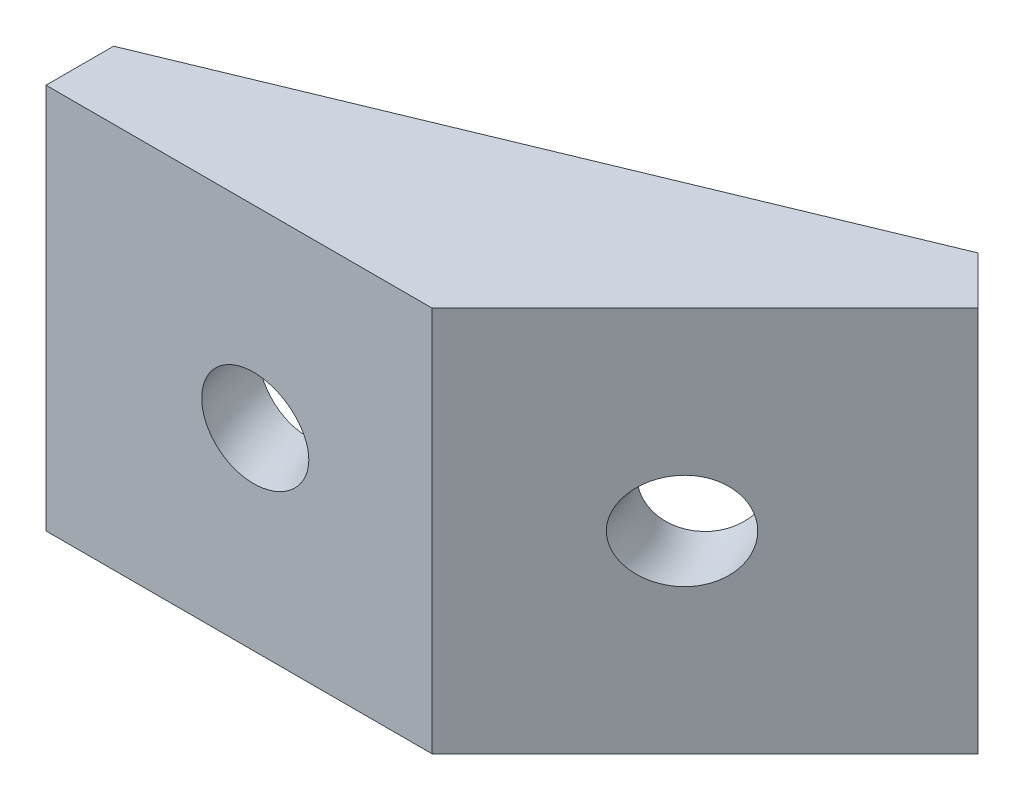
ISO-10303-21;
HEADER;
FILE_DESCRIPTION(('STEP AP214'),'2;1');
FILE_NAME('part.step','',(''),(''),'','','');
FILE_SCHEMA(('AUTOMOTIVE_DESIGN { 1 0 10303 214 1 1 1 1 }'));
ENDSEC;
DATA;
#1=APPLICATION_CONTEXT('core data for automotive mechanical design processes');
#2=APPLICATION_PROTOCOL_DEFINITION('international standard','automotive_design',2000,#1);
#3=PRODUCT_CONTEXT('',#1,'mechanical');
#4=PRODUCT('Part','Part','',(#3));
#5=PRODUCT_RELATED_PRODUCT_CATEGORY('part','',(#4));
#6=PRODUCT_DEFINITION_FORMATION('','',#4);
#7=PRODUCT_DEFINITION_CONTEXT('part definition',#1,'design');
#8=PRODUCT_DEFINITION('design','',#6,#7);
#9=PRODUCT_DEFINITION_SHAPE('','',#8);
#10=(LENGTH_UNIT() NAMED_UNIT(*) SI_UNIT(.MILLI.,.METRE.));
#11=(NAMED_UNIT(*) PLANE_ANGLE_UNIT() SI_UNIT($,.RADIAN.));
#12=(NAMED_UNIT(*) SI_UNIT($,.STERADIAN.) SOLID_ANGLE_UNIT());
#13=UNCERTAINTY_MEASURE_WITH_UNIT(LENGTH_MEASURE(1.E-05),#10,'distance_accuracy_value','');
#14=(GEOMETRIC_REPRESENTATION_CONTEXT(3) GLOBAL_UNCERTAINTY_ASSIGNED_CONTEXT((#13)) GLOBAL_UNIT_ASSIGNED_CONTEXT((#10,
#11,#12)) REPRESENTATION_CONTEXT('',''));
#15=CARTESIAN_POINT('',(0.,0.,0.));
#16=DIRECTION('',(0.,0.,1.));
#17=DIRECTION('',(1.,0.,0.));
#18=AXIS2_PLACEMENT_3D('',#15,#16,#17);
#19=CARTESIAN_POINT('',(14.142135623731,20.,-14.1421356237309));
#20=DIRECTION('',(-0.707106781186544,0.,-0.707106781186551));
#21=DIRECTION('',(-0.707106781186551,0.,0.707106781186544));
#22=AXIS2_PLACEMENT_3D('',#19,#20,#21);
#23=PLANE('',#22);
#24=DIRECTION('',(0.707106781186551,0.,-0.707106781186544));
#25=VECTOR('',#24,1.);
#26=CARTESIAN_POINT('',(14.142135623731,0.,-14.1421356237309));
#27=LINE('',#26,#25);
#28=CARTESIAN_POINT('',(0.,0.,0.));
#29=VERTEX_POINT('',#28);
#30=CARTESIAN_POINT('',(14.142135623731,0.,-14.1421356237309));
#31=VERTEX_POINT('',#30);
#32=EDGE_CURVE('E167',#29,#31,#27,.T.);
#33=ORIENTED_EDGE('',*,*,#32,.T.);
#34=DIRECTION('',(0.,-1.,0.));
#35=VECTOR('',#34,1.);
#36=CARTESIAN_POINT('',(14.142135623731,20.,-14.1421356237309));
#37=LINE('',#36,#35);
#38=CARTESIAN_POINT('',(14.142135623731,20.,-14.1421356237309));
#39=VERTEX_POINT('',#38);
#40=EDGE_CURVE('E11',#39,#31,#37,.T.);
#41=ORIENTED_EDGE('',*,*,#40,.F.);
#42=DIRECTION('',(0.707106781186551,0.,-0.707106781186544));
#43=VECTOR('',#42,1.);
#44=CARTESIAN_POINT('',(14.142135623731,20.,-14.1421356237309));
#45=LINE('',#44,#43);
#46=CARTESIAN_POINT('',(0.,20.,0.));
#47=VERTEX_POINT('',#46);
#48=EDGE_CURVE('E169',#47,#39,#45,.T.);
#49=ORIENTED_EDGE('',*,*,#48,.F.);
#50=DIRECTION('',(0.,-1.,0.));
#51=VECTOR('',#50,1.);
#52=CARTESIAN_POINT('',(0.,20.,0.));
#53=LINE('',#52,#51);
#54=EDGE_CURVE('E177',#47,#29,#53,.T.);
#55=ORIENTED_EDGE('',*,*,#54,.T.);
#56=EDGE_LOOP('',(#33,#41,#49,#55));
#57=FACE_BOUND('',#56,.T.);
#58=CARTESIAN_POINT('',(7.00793546357678,7.57457335447184,-7.00793546357671));
#59=CARTESIAN_POINT('',(7.11300703710958,7.6088847048434,-7.1130070371095));
#60=CARTESIAN_POINT('',(7.21615151872774,7.65511015868409,-7.21615151872766));
#61=CARTESIAN_POINT('',(7.4156584391318,7.77106559172266,-7.41565843913172));
#62=CARTESIAN_POINT('',(7.51202041490097,7.84079717371991,-7.51202041490089));
#63=CARTESIAN_POINT('',(7.69515062243347,8.00286288014445,-7.69515062243339));
#64=CARTESIAN_POINT('',(7.78189077116621,8.09526076382205,-7.78189077116612));
#65=CARTESIAN_POINT('',(7.94236496127605,8.30044230842607,-7.94236496127597));
#66=CARTESIAN_POINT('',(8.01610213426821,8.4132210475764,-8.01610213426813));
#67=CARTESIAN_POINT('',(8.14416068236348,8.64943054891973,-8.14416068236339));
#68=CARTESIAN_POINT('',(8.19931522123127,8.77195778065461,-8.19931522123118));
#69=CARTESIAN_POINT('',(8.29337171344352,9.02891183824999,-8.29337171344344));
#70=CARTESIAN_POINT('',(8.33227894894066,9.16333477945096,-8.33227894894057));
#71=CARTESIAN_POINT('',(8.39078019415316,9.4327681845553,-8.39078019415307));
#72=CARTESIAN_POINT('',(8.41126431331432,9.56739312063776,-8.41126431331423));
#73=CARTESIAN_POINT('',(8.43550447201303,9.8396155519687,-8.43550447201294));
#74=CARTESIAN_POINT('',(8.43926361998243,9.97721249007625,-8.43926361998234));
#75=CARTESIAN_POINT('',(8.43003882207714,10.2478070723917,-8.43003882207705));
#76=CARTESIAN_POINT('',(8.41747170485611,10.3808336179191,-8.41747170485603));
#77=CARTESIAN_POINT('',(8.37675702129216,10.6420172909983,-8.37675702129207));
#78=CARTESIAN_POINT('',(8.34860995367191,10.7701745742775,-8.34860995367183));
#79=CARTESIAN_POINT('',(8.27760834740178,11.0184305211267,-8.27760834740169));
#80=CARTESIAN_POINT('',(8.23471600646603,11.1385075138222,-8.23471600646595));
#81=CARTESIAN_POINT('',(8.13566116648802,11.3671439829561,-8.13566116648793));
#82=CARTESIAN_POINT('',(8.07949744282036,11.4757023951698,-8.07949744282027));
#83=CARTESIAN_POINT('',(7.95388770040742,11.6816436117172,-7.95388770040733));
#84=CARTESIAN_POINT('',(7.88410875889488,11.7786197409564,-7.8841087588948));
#85=CARTESIAN_POINT('',(7.73452147207409,11.9555863714837,-7.73452147207401));
#86=CARTESIAN_POINT('',(7.65471117922423,12.0355735663135,-7.65471117922415));
#87=CARTESIAN_POINT('',(7.48303410530092,12.180753951838,-7.48303410530084));
#88=CARTESIAN_POINT('',(7.39075949935397,12.2449814817206,-7.3907594993539));
#89=CARTESIAN_POINT('',(7.20024422390796,12.3521794419223,-7.20024422390789));
#90=CARTESIAN_POINT('',(7.10200189315453,12.3951439224513,-7.10200189315446));
#91=CARTESIAN_POINT('',(6.89526454568044,12.4617278024309,-6.89526454568037));
#92=CARTESIAN_POINT('',(6.78652633210816,12.4838353987163,-6.78652633210809));
#93=CARTESIAN_POINT('',(6.56795411381444,12.5037967863994,-6.56795411381437));
#94=CARTESIAN_POINT('',(6.45811979089834,12.5016433174724,-6.45811979089827));
#95=CARTESIAN_POINT('',(6.23205486196903,12.4728146623615,-6.23205486196896));
#96=CARTESIAN_POINT('',(6.11593609873216,12.4443774091688,-6.1159360987321));
#97=CARTESIAN_POINT('',(5.88833965445654,12.3616926563325,-5.88833965445648));
#98=CARTESIAN_POINT('',(5.77686476089468,12.307429890977,-5.77686476089462));
#99=CARTESIAN_POINT('',(5.55607277713517,12.171161011109,-5.55607277713512));
#100=CARTESIAN_POINT('',(5.44713827505273,12.0879100991108,-5.44713827505268));
#101=CARTESIAN_POINT('',(5.24102142879013,11.8961031066417,-5.24102142879008));
#102=CARTESIAN_POINT('',(5.14383208244554,11.7875622175701,-5.14383208244549));
#103=CARTESIAN_POINT('',(4.98135680974496,11.5688312586304,-4.9813568097449));
#104=CARTESIAN_POINT('',(4.91347918069405,11.4624804157877,-4.913479180694));
#105=CARTESIAN_POINT('',(4.79091977426208,11.2353184849157,-4.79091977426203));
#106=CARTESIAN_POINT('',(4.73623186168506,11.1145141591972,-4.73623186168502));
#107=CARTESIAN_POINT('',(4.66624608810088,10.9238481302738,-4.66624608810083));
#108=CARTESIAN_POINT('',(4.6448495329538,10.8583674680522,-4.64484953295375));
#109=CARTESIAN_POINT('',(4.60660110321435,10.7248176825582,-4.6066011032143));
#110=CARTESIAN_POINT('',(4.5897466812629,10.6567500346864,-4.58974668126286));
#111=CARTESIAN_POINT('',(4.56095380758557,10.5186201642891,-4.56095380758552));
#112=CARTESIAN_POINT('',(4.54901110509819,10.4485597227807,-4.54901110509815));
#113=CARTESIAN_POINT('',(4.53030333863013,10.3070970282286,-4.53030333863008));
#114=CARTESIAN_POINT('',(4.52353726114097,10.2356950406463,-4.52353726114092));
#115=CARTESIAN_POINT('',(4.51252649413541,10.0420486561876,-4.51252649413537));
#116=CARTESIAN_POINT('',(4.51334895761543,9.91914755388458,-4.51334895761538));
#117=CARTESIAN_POINT('',(4.53049202157717,9.67562112636098,-4.53049202157712));
#118=CARTESIAN_POINT('',(4.54681159340415,9.55499565063261,-4.5468115934041));
#119=CARTESIAN_POINT('',(4.59248410575177,9.32572415569555,-4.59248410575172));
#120=CARTESIAN_POINT('',(4.62110454861539,9.21678184678911,-4.62110454861534));
#121=CARTESIAN_POINT('',(4.68959678852634,9.00626502138619,-4.68959678852629));
#122=CARTESIAN_POINT('',(4.7294716465989,8.90469251882314,-4.72947164659885));
#123=CARTESIAN_POINT('',(4.82376872790658,8.69961494487228,-4.82376872790653));
#124=CARTESIAN_POINT('',(4.87931449049717,8.59714712261321,-4.87931449049712));
#125=CARTESIAN_POINT('',(5.00012492356079,8.40442596804756,-5.00012492356074));
#126=CARTESIAN_POINT('',(5.06539500652627,8.31417949180435,-5.06539500652622));
#127=CARTESIAN_POINT('',(5.21563844734636,8.13252747916903,-5.2156384473463));
#128=CARTESIAN_POINT('',(5.30207463491266,8.04353800846273,-5.3020746349126));
#129=CARTESIAN_POINT('',(5.48331864792473,7.88460803787753,-5.48331864792467));
#130=CARTESIAN_POINT('',(5.57813211814325,7.81468051393079,-5.57813211814319));
#131=CARTESIAN_POINT('',(5.78621989056229,7.68745015433804,-5.78621989056223));
#132=CARTESIAN_POINT('',(5.9003186093454,7.63282788880199,-5.90031860934534));
#133=CARTESIAN_POINT('',(6.13327074378256,7.5506030003885,-6.13327074378249));
#134=CARTESIAN_POINT('',(6.25212313481995,7.52299458720814,-6.25212313481988));
#135=CARTESIAN_POINT('',(6.47816882444807,7.49757505789354,-6.478168824448));
#136=CARTESIAN_POINT('',(6.58519806084956,7.49680654222506,-6.58519806084949));
#137=CARTESIAN_POINT('',(6.79809217502363,7.518332242579,-6.79809217502356));
#138=CARTESIAN_POINT('',(6.90395741357688,7.5406190965832,-6.90395741357681));
#139=CARTESIAN_POINT('',(7.00793546357678,7.57457335447184,-7.00793546357671));
#140=B_SPLINE_CURVE_WITH_KNOTS('',3,(#58,#59,#60,#61,#62,#63,#64,#65,#66,#67,#68,#69,#70,#71,
#72,#73,#74,#75,#76,#77,#78,#79,#80,#81,#82,#83,#84,#85,#86,#87,#88,#89,#90,#91,#92,#93,#94,#95,
#96,#97,#98,#99,#100,#101,#102,#103,#104,#105,#106,#107,#108,#109,#110,#111,#112,#113,#114,#115,
#116,#117,#118,#119,#120,#121,#122,#123,#124,#125,#126,#127,#128,#129,#130,#131,#132,#133,#134,
#135,#136,#137,#138,#139),.UNSPECIFIED.,.T.,.F.,(4,2,2,2,2,2,2,2,2,2,2,2,2,2,2,2,2,2,2,2,2,2,2,
2,2,2,2,2,2,2,2,2,2,2,2,2,2,2,2,2,4),(0.,0.45702514083286,0.914081450892144,1.37243848600095,
1.83068497994985,2.26419703433662,2.69756803990306,3.10865808731597,3.51967172809245,
3.920395112311,4.32110566989777,4.7228512816299,5.12463397918368,5.53786733782967,
5.95118104815038,6.3856299118918,6.82020027373525,7.28428121275353,7.74850103552131,
8.24629169140353,8.74437696234767,9.26721678035148,9.78974334047956,10.2178865605638,
10.6458302440937,10.8619570195237,11.0779623313911,11.2937803098716,11.509556023486,
11.8761371770074,12.2426939995971,12.5899254529004,12.9372514388977,13.3231354855979,
13.7092351207993,14.1610368205724,14.6131453090943,15.1219154108533,15.6305764360268,
16.0829895458168,16.5352582360719),.UNSPECIFIED.);
#141=CARTESIAN_POINT('',(7.00793546357678,7.57457335447184,-7.00793546357671));
#142=VERTEX_POINT('',#141);
#143=EDGE_CURVE('E212',#142,#142,#140,.T.);
#144=ORIENTED_EDGE('',*,*,#143,.F.);
#145=EDGE_LOOP('',(#144));
#146=FACE_BOUND('',#145,.T.);
#147=ADVANCED_FACE('F38',(#57,#146),#23,.F.);
#148=CARTESIAN_POINT('',(-20.,20.,0.));
#149=DIRECTION('',(0.,0.,-1.));
#150=DIRECTION('',(-1.,0.,0.));
#151=AXIS2_PLACEMENT_3D('',#148,#149,#150);
#152=PLANE('',#151);
#153=DIRECTION('',(1.,0.,0.));
#154=VECTOR('',#153,1.);
#155=CARTESIAN_POINT('',(-20.,0.,0.));
#156=LINE('',#155,#154);
#157=CARTESIAN_POINT('',(-20.,0.,0.));
#158=VERTEX_POINT('',#157);
#159=EDGE_CURVE('E171',#158,#29,#156,.T.);
#160=ORIENTED_EDGE('',*,*,#159,.T.);
#161=ORIENTED_EDGE('',*,*,#54,.F.);
#162=DIRECTION('',(1.,0.,0.));
#163=VECTOR('',#162,1.);
#164=CARTESIAN_POINT('',(-20.,20.,0.));
#165=LINE('',#164,#163);
#166=CARTESIAN_POINT('',(-20.,20.,0.));
#167=VERTEX_POINT('',#166);
#168=EDGE_CURVE('E175',#167,#47,#165,.T.);
#169=ORIENTED_EDGE('',*,*,#168,.F.);
#170=DIRECTION('',(0.,-1.,0.));
#171=VECTOR('',#170,1.);
#172=CARTESIAN_POINT('',(-20.,20.,0.));
#173=LINE('',#172,#171);
#174=EDGE_CURVE('E186',#167,#158,#173,.T.);
#175=ORIENTED_EDGE('',*,*,#174,.T.);
#176=EDGE_LOOP('',(#160,#161,#169,#175));
#177=FACE_BOUND('',#176,.T.);
#178=CARTESIAN_POINT('',(-11.6131887280544,8.81063822745531,0.));
#179=CARTESIAN_POINT('',(-11.542207651181,8.68657041721591,0.));
#180=CARTESIAN_POINT('',(-11.4602790004278,8.56866710046768,0.));
#181=CARTESIAN_POINT('',(-11.277465300859,8.34849916431138,0.));
#182=CARTESIAN_POINT('',(-11.1765581557101,8.24625302859666,0.));
#183=CARTESIAN_POINT('',(-10.9594997653759,8.06017441693327,0.));
#184=CARTESIAN_POINT('',(-10.843390002046,7.97629343664305,0.));
#185=CARTESIAN_POINT('',(-10.5992967617775,7.82824028583367,0.));
#186=CARTESIAN_POINT('',(-10.4713147696736,7.76406565499853,0.));
#187=CARTESIAN_POINT('',(-10.2008524579107,7.65379536608885,0.));
#188=CARTESIAN_POINT('',(-10.0579750652831,7.60867573767679,0.));
#189=CARTESIAN_POINT('',(-9.76694164254037,7.54127610184766,0.));
#190=CARTESIAN_POINT('',(-9.61878385163514,7.51900378819122,0.));
#191=CARTESIAN_POINT('',(-9.30996873386102,7.49626277169984,0.));
#192=CARTESIAN_POINT('',(-9.14918595535699,7.49749748210169,0.));
#193=CARTESIAN_POINT('',(-8.82981028277565,7.5251622689736,0.));
#194=CARTESIAN_POINT('',(-8.67121807077643,7.55160002117751,0.));
#195=CARTESIAN_POINT('',(-8.34968580602094,7.63111376760351,0.));
#196=CARTESIAN_POINT('',(-8.18715075926464,7.68583430697187,0.));
#197=CARTESIAN_POINT('',(-7.87311555412536,7.82120899805572,0.));
#198=CARTESIAN_POINT('',(-7.72162360759926,7.90188221216261,0.));
#199=CARTESIAN_POINT('',(-7.43127551750286,8.08959042547379,0.));
#200=CARTESIAN_POINT('',(-7.29275558542708,8.19714833273471,0.));
#201=CARTESIAN_POINT('',(-7.0378298521171,8.43586913383699,0.));
#202=CARTESIAN_POINT('',(-6.92139150340639,8.56699672224609,0.));
#203=CARTESIAN_POINT('',(-6.74387447975076,8.81348645564075,0.));
#204=CARTESIAN_POINT('',(-6.67626616164672,8.92416000752192,0.));
#205=CARTESIAN_POINT('',(-6.56022014699033,9.15515256014065,0.));
#206=CARTESIAN_POINT('',(-6.51176433013127,9.27546231374288,0.));
#207=CARTESIAN_POINT('',(-6.43688197987082,9.52367304868017,0.));
#208=CARTESIAN_POINT('',(-6.41059575665256,9.65161697294311,0.));
#209=CARTESIAN_POINT('',(-6.38274692108409,9.91016964300215,0.));
#210=CARTESIAN_POINT('',(-6.38117255120891,10.0407770919136,0.));
#211=CARTESIAN_POINT('',(-6.4017021870176,10.2863644606745,0.));
#212=CARTESIAN_POINT('',(-6.42136370430712,10.4015584905457,0.));
#213=CARTESIAN_POINT('',(-6.47925309357778,10.6271561612938,0.));
#214=CARTESIAN_POINT('',(-6.5174846779057,10.737558839521,0.));
#215=CARTESIAN_POINT('',(-6.61164245763813,10.9541213440752,0.));
#216=CARTESIAN_POINT('',(-6.66802961650844,11.0600788278073,0.));
#217=CARTESIAN_POINT('',(-6.79552426968834,11.2626882244955,0.));
#218=CARTESIAN_POINT('',(-6.86663764784843,11.3593363952383,0.));
#219=CARTESIAN_POINT('',(-7.03285443431303,11.5560706461353,0.));
#220=CARTESIAN_POINT('',(-7.12995973774913,11.6544633022374,0.));
#221=CARTESIAN_POINT('',(-7.33724471882186,11.8363356751883,0.));
#222=CARTESIAN_POINT('',(-7.44743255044893,11.9198060092899,0.));
#223=CARTESIAN_POINT('',(-7.69680579300748,12.083151215496,0.));
#224=CARTESIAN_POINT('',(-7.83780129799014,12.1602726523727,0.));
#225=CARTESIAN_POINT('',(-8.12999484129275,12.2919242175349,0.));
#226=CARTESIAN_POINT('',(-8.28119775884965,12.3464434515631,0.));
#227=CARTESIAN_POINT('',(-8.60332658363618,12.435230040816,0.));
#228=CARTESIAN_POINT('',(-8.77483861182784,12.4673925754244,0.));
#229=CARTESIAN_POINT('',(-9.12087496495412,12.5021561133576,0.));
#230=CARTESIAN_POINT('',(-9.29539944060001,12.5047556333411,0.));
#231=CARTESIAN_POINT('',(-9.64031931917153,12.4794639105731,0.));
#232=CARTESIAN_POINT('',(-9.81073907429685,12.4519136913998,0.));
#233=CARTESIAN_POINT('',(-10.1438434777289,12.3665075844328,0.));
#234=CARTESIAN_POINT('',(-10.3065310042205,12.3086630710594,0.));
#235=CARTESIAN_POINT('',(-10.6077186476019,12.1682796496032,0.));
#236=CARTESIAN_POINT('',(-10.7471088827308,12.087653117263,0.));
#237=CARTESIAN_POINT('',(-11.0088551330523,11.9023133712768,0.));
#238=CARTESIAN_POINT('',(-11.1312195746579,11.7976121412408,0.));
#239=CARTESIAN_POINT('',(-11.3454865304418,11.5758309939097,0.));
#240=CARTESIAN_POINT('',(-11.4390023304224,11.4603085023067,0.));
#241=CARTESIAN_POINT('',(-11.6038300219748,11.2143795348785,0.));
#242=CARTESIAN_POINT('',(-11.6751512008936,11.0839793159456,0.));
#243=CARTESIAN_POINT('',(-11.7892403802551,10.8204973261638,0.));
#244=CARTESIAN_POINT('',(-11.8334627113814,10.6880439627961,0.));
#245=CARTESIAN_POINT('',(-11.8981750526514,10.4174399125518,0.));
#246=CARTESIAN_POINT('',(-11.9186667703853,10.2792896363504,0.));
#247=CARTESIAN_POINT('',(-11.9348708092421,10.0062108798924,0.));
#248=CARTESIAN_POINT('',(-11.9313892933528,9.87132926394981,0.));
#249=CARTESIAN_POINT('',(-11.9016628181954,9.60418475516401,0.));
#250=CARTESIAN_POINT('',(-11.87543840114,9.47191960926818,0.));
#251=CARTESIAN_POINT('',(-11.8116647909341,9.25004715488744,0.));
#252=CARTESIAN_POINT('',(-11.7793644168565,9.1588917421428,0.));
#253=CARTESIAN_POINT('',(-11.7041047762691,8.98109895418288,0.));
#254=CARTESIAN_POINT('',(-11.6611453726664,8.8944616370952,0.));
#255=CARTESIAN_POINT('',(-11.6131887280544,8.81063822745531,0.));
#256=B_SPLINE_CURVE_WITH_KNOTS('',3,(#178,#179,#180,#181,#182,#183,#184,#185,#186,#187,#188,
#189,#190,#191,#192,#193,#194,#195,#196,#197,#198,#199,#200,#201,#202,#203,#204,#205,#206,#207,
#208,#209,#210,#211,#212,#213,#214,#215,#216,#217,#218,#219,#220,#221,#222,#223,#224,#225,#226,
#227,#228,#229,#230,#231,#232,#233,#234,#235,#236,#237,#238,#239,#240,#241,#242,#243,#244,#245,
#246,#247,#248,#249,#250,#251,#252,#253,#254,#255),.UNSPECIFIED.,.T.,.F.,(4,2,2,2,2,2,2,2,2,2,2,
2,2,2,2,2,2,2,2,2,2,2,2,2,2,2,2,2,2,2,2,2,2,2,2,2,2,2,4),(0.,0.42844119792383,0.857384345601372,
1.28518056404036,1.71292335085792,2.16049560233801,2.60821852292377,3.08850118165057,
3.568930160018,4.08110032871428,4.59364755162068,5.11706738870354,5.63970962270719,
6.0272315650709,6.41438598772202,6.80397268525561,7.19337401772658,7.5423282110273,
7.89135219257766,8.25004766651178,8.60888673444973,9.02203399859141,9.43544013167979,
9.91555280481272,10.3958966238612,10.9168988560109,11.4379272296314,11.9531226001766,
12.4681246718811,12.9486503806548,13.4289374150147,13.8725210917059,14.3159189002749,
14.7327594759321,15.1495700550136,15.552434395667,15.9549352331859,16.2443974236333,
16.5338633372403),.UNSPECIFIED.);
#257=CARTESIAN_POINT('',(-11.6131887280544,8.81063822745531,0.));
#258=VERTEX_POINT('',#257);
#259=EDGE_CURVE('E42',#258,#258,#256,.T.);
#260=ORIENTED_EDGE('',*,*,#259,.F.);
#261=EDGE_LOOP('',(#260));
#262=FACE_BOUND('',#261,.T.);
#263=ADVANCED_FACE('F206',(#177,#262),#152,.F.);
#264=CARTESIAN_POINT('',(-1.44974746830582,20.,-3.5));
#265=DIRECTION('',(0.707106781186544,0.,0.707106781186551));
#266=DIRECTION('',(0.707106781186551,0.,-0.707106781186544));
#267=AXIS2_PLACEMENT_3D('',#264,#265,#266);
#268=PLANE('',#267);
#269=CARTESIAN_POINT('',(4.59619407771261,10.,-9.54594154601837));
#270=DIRECTION('',(0.707106781186544,0.,0.707106781186551));
#271=DIRECTION('',(0.707106781186551,0.,-0.707106781186544));
#272=AXIS2_PLACEMENT_3D('',#269,#270,#271);
#273=CIRCLE('',#272,2.5);
#274=CARTESIAN_POINT('',(6.36396103067899,10.,-11.3137084989847));
#275=VERTEX_POINT('',#274);
#276=EDGE_CURVE('E159',#275,#275,#273,.F.);
#277=ORIENTED_EDGE('',*,*,#276,.F.);
#278=EDGE_LOOP('',(#277));
#279=FACE_BOUND('',#278,.T.);
#280=DIRECTION('',(0.,-1.,0.));
#281=VECTOR('',#280,1.);
#282=CARTESIAN_POINT('',(11.6672618895781,20.,-16.6170093578838));
#283=LINE('',#282,#281);
#284=CARTESIAN_POINT('',(11.6672618895781,18.,-16.6170093578838));
#285=VERTEX_POINT('',#284);
#286=CARTESIAN_POINT('',(11.6672618895781,2.,-16.6170093578838));
#287=VERTEX_POINT('',#286);
#288=EDGE_CURVE('E129',#285,#287,#283,.T.);
#289=ORIENTED_EDGE('',*,*,#288,.T.);
#290=DIRECTION('',(0.707106781186551,0.,-0.707106781186544));
#291=VECTOR('',#290,1.);
#292=CARTESIAN_POINT('',(-2.4748737341529,2.,-2.47487373415293));
#293=LINE('',#292,#291);
#294=CARTESIAN_POINT('',(-1.44974746830582,2.,-3.5));
#295=VERTEX_POINT('',#294);
#296=EDGE_CURVE('E59',#295,#287,#293,.T.);
#297=ORIENTED_EDGE('',*,*,#296,.F.);
#298=DIRECTION('',(0.,-1.,0.));
#299=VECTOR('',#298,1.);
#300=CARTESIAN_POINT('',(-1.44974746830582,20.,-3.5));
#301=LINE('',#300,#299);
#302=CARTESIAN_POINT('',(-1.44974746830582,18.,-3.5));
#303=VERTEX_POINT('',#302);
#304=EDGE_CURVE('E121',#303,#295,#301,.T.);
#305=ORIENTED_EDGE('',*,*,#304,.F.);
#306=DIRECTION('',(0.707106781186551,0.,-0.707106781186544));
#307=VECTOR('',#306,1.);
#308=CARTESIAN_POINT('',(11.6672618895781,18.,-16.6170093578838));
#309=LINE('',#308,#307);
#310=EDGE_CURVE('E111',#303,#285,#309,.T.);
#311=ORIENTED_EDGE('',*,*,#310,.T.);
#312=EDGE_LOOP('',(#289,#297,#305,#311));
#313=FACE_BOUND('',#312,.T.);
#314=ADVANCED_FACE('F128',(#279,#313),#268,.F.);
#315=CARTESIAN_POINT('',(-20.,20.,-3.5));
#316=DIRECTION('',(0.,0.,1.));
#317=DIRECTION('',(1.,0.,0.));
#318=AXIS2_PLACEMENT_3D('',#315,#316,#317);
#319=PLANE('',#318);
#320=CARTESIAN_POINT('',(-10.,10.,-3.5));
#321=DIRECTION('',(0.,0.,1.));
#322=DIRECTION('',(1.,0.,0.));
#323=AXIS2_PLACEMENT_3D('',#320,#321,#322);
#324=CIRCLE('',#323,2.5);
#325=CARTESIAN_POINT('',(-7.5,10.,-3.5));
#326=VERTEX_POINT('',#325);
#327=EDGE_CURVE('E214',#326,#326,#324,.F.);
#328=ORIENTED_EDGE('',*,*,#327,.F.);
#329=EDGE_LOOP('',(#328));
#330=FACE_BOUND('',#329,.T.);
#331=ORIENTED_EDGE('',*,*,#304,.T.);
#332=DIRECTION('',(1.,0.,0.));
#333=VECTOR('',#332,1.);
#334=CARTESIAN_POINT('',(0.,2.,-3.5));
#335=LINE('',#334,#333);
#336=CARTESIAN_POINT('',(-20.,2.,-3.5));
#337=VERTEX_POINT('',#336);
#338=EDGE_CURVE('E149',#337,#295,#335,.T.);
#339=ORIENTED_EDGE('',*,*,#338,.F.);
#340=DIRECTION('',(0.,-1.,0.));
#341=VECTOR('',#340,1.);
#342=CARTESIAN_POINT('',(-20.,20.,-3.5));
#343=LINE('',#342,#341);
#344=CARTESIAN_POINT('',(-20.,18.,-3.5));
#345=VERTEX_POINT('',#344);
#346=EDGE_CURVE('E124',#345,#337,#343,.T.);
#347=ORIENTED_EDGE('',*,*,#346,.F.);
#348=DIRECTION('',(1.,0.,0.));
#349=VECTOR('',#348,1.);
#350=CARTESIAN_POINT('',(-1.44974746830582,18.,-3.5));
#351=LINE('',#350,#349);
#352=EDGE_CURVE('E114',#345,#303,#351,.T.);
#353=ORIENTED_EDGE('',*,*,#352,.T.);
#354=EDGE_LOOP('',(#331,#339,#347,#353));
#355=FACE_BOUND('',#354,.T.);
#356=ADVANCED_FACE('F120',(#330,#355),#319,.F.);
#357=CARTESIAN_POINT('',(11.6672618895781,20.,-16.6170093578838));
#358=DIRECTION('',(-0.707106781186551,0.,0.707106781186544));
#359=DIRECTION('',(0.707106781186544,0.,0.707106781186551));
#360=AXIS2_PLACEMENT_3D('',#357,#358,#359);
#361=PLANE('',#360);
#362=DIRECTION('',(-0.707106781186544,0.,-0.707106781186551));
#363=VECTOR('',#362,1.);
#364=CARTESIAN_POINT('',(11.6672618895781,0.,-16.6170093578838));
#365=LINE('',#364,#363);
#366=CARTESIAN_POINT('',(11.6672618895781,0.,-16.6170093578838));
#367=VERTEX_POINT('',#366);
#368=EDGE_CURVE('E180',#31,#367,#365,.T.);
#369=ORIENTED_EDGE('',*,*,#368,.T.);
#370=DIRECTION('',(0.,-1.,0.));
#371=VECTOR('',#370,1.);
#372=CARTESIAN_POINT('',(11.6672618895781,2.,-16.6170093578838));
#373=LINE('',#372,#371);
#374=EDGE_CURVE('E67',#287,#367,#373,.T.);
#375=ORIENTED_EDGE('',*,*,#374,.F.);
#376=ORIENTED_EDGE('',*,*,#288,.F.);
#377=CARTESIAN_POINT('',(11.6672618895781,20.,-16.6170093578838));
#378=VERTEX_POINT('',#377);
#379=EDGE_CURVE('E52',#378,#285,#283,.T.);
#380=ORIENTED_EDGE('',*,*,#379,.F.);
#381=DIRECTION('',(-0.707106781186544,0.,-0.707106781186551));
#382=VECTOR('',#381,1.);
#383=CARTESIAN_POINT('',(11.6672618895781,20.,-16.6170093578838));
#384=LINE('',#383,#382);
#385=EDGE_CURVE('E141',#39,#378,#384,.T.);
#386=ORIENTED_EDGE('',*,*,#385,.F.);
#387=ORIENTED_EDGE('',*,*,#40,.T.);
#388=EDGE_LOOP('',(#369,#375,#376,#380,#386,#387));
#389=FACE_BOUND('',#388,.T.);
#390=ADVANCED_FACE('F140',(#389),#361,.F.);
#391=CARTESIAN_POINT('',(-20.,20.,0.));
#392=DIRECTION('',(1.,0.,0.));
#393=DIRECTION('',(0.,0.,-1.));
#394=AXIS2_PLACEMENT_3D('',#391,#392,#393);
#395=PLANE('',#394);
#396=DIRECTION('',(0.,0.,1.));
#397=VECTOR('',#396,1.);
#398=CARTESIAN_POINT('',(-20.,0.,0.));
#399=LINE('',#398,#397);
#400=CARTESIAN_POINT('',(-20.,0.,-3.5));
#401=VERTEX_POINT('',#400);
#402=EDGE_CURVE('E182',#401,#158,#399,.T.);
#403=ORIENTED_EDGE('',*,*,#402,.T.);
#404=ORIENTED_EDGE('',*,*,#174,.F.);
#405=DIRECTION('',(0.,0.,1.));
#406=VECTOR('',#405,1.);
#407=CARTESIAN_POINT('',(-20.,20.,0.));
#408=LINE('',#407,#406);
#409=CARTESIAN_POINT('',(-20.,20.,-3.5));
#410=VERTEX_POINT('',#409);
#411=EDGE_CURVE('E173',#410,#167,#408,.T.);
#412=ORIENTED_EDGE('',*,*,#411,.F.);
#413=EDGE_CURVE('E130',#410,#345,#343,.T.);
#414=ORIENTED_EDGE('',*,*,#413,.T.);
#415=ORIENTED_EDGE('',*,*,#346,.T.);
#416=DIRECTION('',(0.,-1.,0.));
#417=VECTOR('',#416,1.);
#418=CARTESIAN_POINT('',(-20.,2.,-3.5));
#419=LINE('',#418,#417);
#420=EDGE_CURVE('E155',#337,#401,#419,.T.);
#421=ORIENTED_EDGE('',*,*,#420,.T.);
#422=EDGE_LOOP('',(#403,#404,#412,#414,#415,#421));
#423=FACE_BOUND('',#422,.T.);
#424=ADVANCED_FACE('F193',(#423),#395,.F.);
#425=CARTESIAN_POINT('',(0.,20.,0.));
#426=DIRECTION('',(0.,1.,0.));
#427=DIRECTION('',(0.,0.,1.));
#428=AXIS2_PLACEMENT_3D('',#425,#426,#427);
#429=PLANE('',#428);
#430=DIRECTION('',(-0.923879532511288,0.,0.382683432365087));
#431=VECTOR('',#430,1.);
#432=CARTESIAN_POINT('',(-20.,20.,-3.5));
#433=LINE('',#432,#431);
#434=EDGE_CURVE('E126',#378,#410,#433,.T.);
#435=ORIENTED_EDGE('',*,*,#434,.T.);
#436=ORIENTED_EDGE('',*,*,#411,.T.);
#437=ORIENTED_EDGE('',*,*,#168,.T.);
#438=ORIENTED_EDGE('',*,*,#48,.T.);
#439=ORIENTED_EDGE('',*,*,#385,.T.);
#440=EDGE_LOOP('',(#435,#436,#437,#438,#439));
#441=FACE_BOUND('',#440,.T.);
#442=ADVANCED_FACE('F197',(#441),#429,.T.);
#443=CARTESIAN_POINT('',(0.,0.,0.));
#444=DIRECTION('',(0.,1.,0.));
#445=DIRECTION('',(0.,0.,1.));
#446=AXIS2_PLACEMENT_3D('',#443,#444,#445);
#447=PLANE('',#446);
#448=ORIENTED_EDGE('',*,*,#402,.F.);
#449=DIRECTION('',(-0.923879532511288,0.,0.382683432365087));
#450=VECTOR('',#449,1.);
#451=CARTESIAN_POINT('',(-4.16636905521094,0.,-10.0585046789419));
#452=LINE('',#451,#450);
#453=EDGE_CURVE('E156',#367,#401,#452,.T.);
#454=ORIENTED_EDGE('',*,*,#453,.F.);
#455=ORIENTED_EDGE('',*,*,#368,.F.);
#456=ORIENTED_EDGE('',*,*,#32,.F.);
#457=ORIENTED_EDGE('',*,*,#159,.F.);
#458=EDGE_LOOP('',(#448,#454,#455,#456,#457));
#459=FACE_BOUND('',#458,.T.);
#460=ADVANCED_FACE('F205',(#459),#447,.F.);
#461=CARTESIAN_POINT('',(-20.,18.,-3.5));
#462=DIRECTION('',(-0.382683432365087,0.,-0.923879532511288));
#463=DIRECTION('',(-0.923879532511288,0.,0.382683432365087));
#464=AXIS2_PLACEMENT_3D('',#461,#462,#463);
#465=PLANE('',#464);
#466=ORIENTED_EDGE('',*,*,#434,.F.);
#467=ORIENTED_EDGE('',*,*,#379,.T.);
#468=DIRECTION('',(-0.923879532511288,0.,0.382683432365087));
#469=VECTOR('',#468,1.);
#470=CARTESIAN_POINT('',(-20.,18.,-3.5));
#471=LINE('',#470,#469);
#472=EDGE_CURVE('E116',#285,#345,#471,.T.);
#473=ORIENTED_EDGE('',*,*,#472,.T.);
#474=ORIENTED_EDGE('',*,*,#413,.F.);
#475=EDGE_LOOP('',(#466,#467,#473,#474));
#476=FACE_BOUND('',#475,.T.);
#477=ADVANCED_FACE('F137',(#476),#465,.T.);
#478=CARTESIAN_POINT('',(0.,18.,0.));
#479=DIRECTION('',(0.,1.,0.));
#480=DIRECTION('',(0.,0.,1.));
#481=AXIS2_PLACEMENT_3D('',#478,#479,#480);
#482=PLANE('',#481);
#483=ORIENTED_EDGE('',*,*,#352,.F.);
#484=ORIENTED_EDGE('',*,*,#472,.F.);
#485=ORIENTED_EDGE('',*,*,#310,.F.);
#486=EDGE_LOOP('',(#483,#484,#485));
#487=FACE_BOUND('',#486,.T.);
#488=ADVANCED_FACE('F113',(#487),#482,.F.);
#489=CARTESIAN_POINT('',(-4.16636905521094,2.,-10.0585046789419));
#490=DIRECTION('',(0.382683432365087,0.,0.923879532511288));
#491=DIRECTION('',(0.923879532511288,0.,-0.382683432365087));
#492=AXIS2_PLACEMENT_3D('',#489,#490,#491);
#493=PLANE('',#492);
#494=ORIENTED_EDGE('',*,*,#453,.T.);
#495=ORIENTED_EDGE('',*,*,#420,.F.);
#496=DIRECTION('',(-0.923879532511288,0.,0.382683432365087));
#497=VECTOR('',#496,1.);
#498=CARTESIAN_POINT('',(-4.16636905521094,2.,-10.0585046789419));
#499=LINE('',#498,#497);
#500=EDGE_CURVE('E147',#287,#337,#499,.T.);
#501=ORIENTED_EDGE('',*,*,#500,.F.);
#502=ORIENTED_EDGE('',*,*,#374,.T.);
#503=EDGE_LOOP('',(#494,#495,#501,#502));
#504=FACE_BOUND('',#503,.T.);
#505=ADVANCED_FACE('F153',(#504),#493,.F.);
#506=CARTESIAN_POINT('',(0.,2.,0.));
#507=DIRECTION('',(0.,1.,0.));
#508=DIRECTION('',(0.,0.,1.));
#509=AXIS2_PLACEMENT_3D('',#506,#507,#508);
#510=PLANE('',#509);
#511=ORIENTED_EDGE('',*,*,#500,.T.);
#512=ORIENTED_EDGE('',*,*,#338,.T.);
#513=ORIENTED_EDGE('',*,*,#296,.T.);
#514=EDGE_LOOP('',(#511,#512,#513));
#515=FACE_BOUND('',#514,.T.);
#516=ADVANCED_FACE('F146',(#515),#510,.T.);
#517=CARTESIAN_POINT('',(-1.44974746830582,10.,-3.5));
#518=DIRECTION('',(0.,1.,0.));
#519=DIRECTION('',(0.,0.,1.));
#520=AXIS2_PLACEMENT_3D('',#517,#518,#519);
#521=TOROIDAL_SURFACE('',#520,8.55025253169418,2.5);
#522=ORIENTED_EDGE('',*,*,#259,.T.);
#523=EDGE_LOOP('',(#522));
#524=FACE_BOUND('',#523,.T.);
#525=ORIENTED_EDGE('',*,*,#327,.T.);
#526=EDGE_LOOP('',(#525));
#527=FACE_BOUND('',#526,.T.);
#528=ADVANCED_FACE('F226',(#524,#527),#521,.F.);
#529=ORIENTED_EDGE('',*,*,#143,.T.);
#530=EDGE_LOOP('',(#529));
#531=FACE_BOUND('',#530,.T.);
#532=ORIENTED_EDGE('',*,*,#276,.T.);
#533=EDGE_LOOP('',(#532));
#534=FACE_BOUND('',#533,.T.);
#535=ADVANCED_FACE('F222',(#531,#534),#521,.F.);
#536=CLOSED_SHELL('',(#147,#263,#314,#356,#390,#424,#442,#460,#477,#488,#505,#516,#528,#535));
#537=MANIFOLD_SOLID_BREP('B2',#536);
#538=ADVANCED_BREP_SHAPE_REPRESENTATION('',(#18,#537),#14);
#539=SHAPE_DEFINITION_REPRESENTATION(#9,#538);
ENDSEC;
END-ISO-10303-21;
